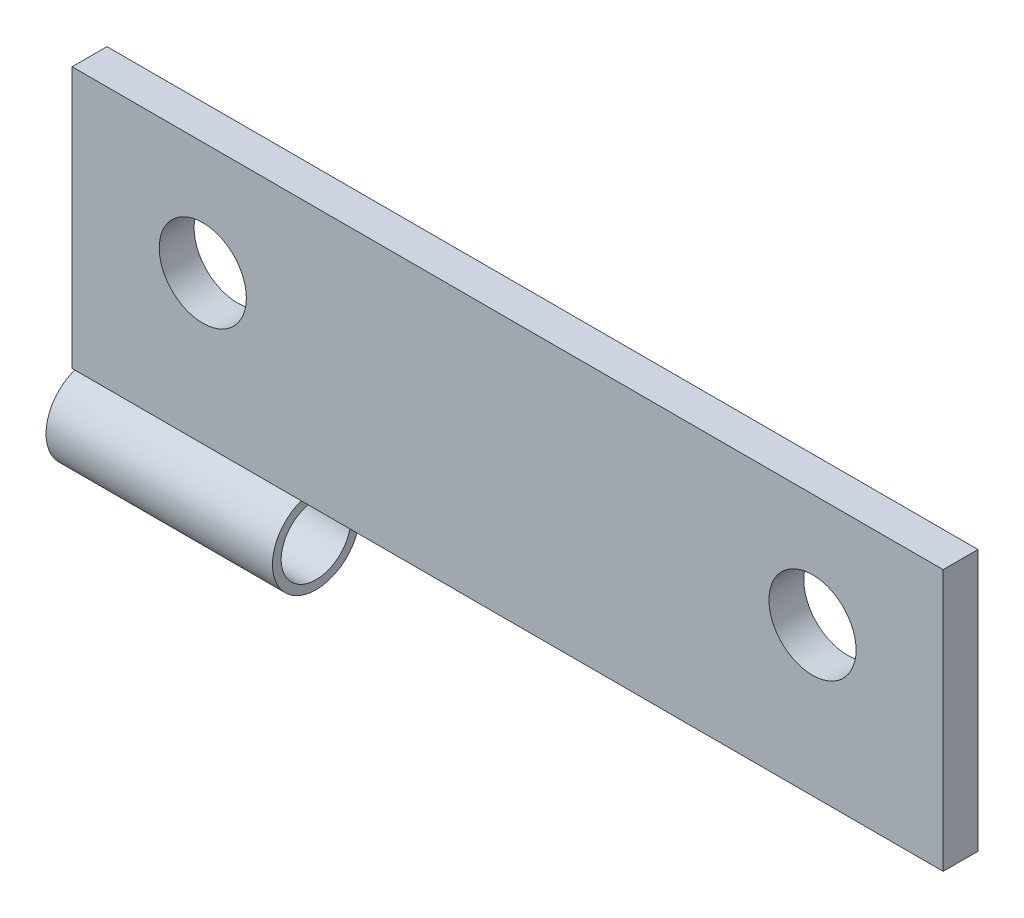
ISO-10303-21;
HEADER;
FILE_DESCRIPTION(('STEP AP214'),'2;1');
FILE_NAME('part.step','',(''),(''),'','','');
FILE_SCHEMA(('AUTOMOTIVE_DESIGN { 1 0 10303 214 1 1 1 1 }'));
ENDSEC;
DATA;
#1=APPLICATION_CONTEXT('core data for automotive mechanical design processes');
#2=APPLICATION_PROTOCOL_DEFINITION('international standard','automotive_design',2000,#1);
#3=PRODUCT_CONTEXT('',#1,'mechanical');
#4=PRODUCT('Part','Part','',(#3));
#5=PRODUCT_RELATED_PRODUCT_CATEGORY('part','',(#4));
#6=PRODUCT_DEFINITION_FORMATION('','',#4);
#7=PRODUCT_DEFINITION_CONTEXT('part definition',#1,'design');
#8=PRODUCT_DEFINITION('design','',#6,#7);
#9=PRODUCT_DEFINITION_SHAPE('','',#8);
#10=(LENGTH_UNIT() NAMED_UNIT(*) SI_UNIT(.MILLI.,.METRE.));
#11=(NAMED_UNIT(*) PLANE_ANGLE_UNIT() SI_UNIT($,.RADIAN.));
#12=(NAMED_UNIT(*) SI_UNIT($,.STERADIAN.) SOLID_ANGLE_UNIT());
#13=UNCERTAINTY_MEASURE_WITH_UNIT(LENGTH_MEASURE(1.E-05),#10,'distance_accuracy_value','');
#14=(GEOMETRIC_REPRESENTATION_CONTEXT(3) GLOBAL_UNCERTAINTY_ASSIGNED_CONTEXT((#13)) GLOBAL_UNIT_ASSIGNED_CONTEXT((#10,
#11,#12)) REPRESENTATION_CONTEXT('',''));
#15=CARTESIAN_POINT('',(0.,0.,0.));
#16=DIRECTION('',(0.,0.,1.));
#17=DIRECTION('',(1.,0.,0.));
#18=AXIS2_PLACEMENT_3D('',#15,#16,#17);
#19=CARTESIAN_POINT('',(6.21190339065838,-14.6397379912664,-1.));
#20=DIRECTION('',(-1.,0.,0.));
#21=DIRECTION('',(0.,0.,1.));
#22=AXIS2_PLACEMENT_3D('',#19,#20,#21);
#23=CYLINDRICAL_SURFACE('',#22,2.5);
#24=CARTESIAN_POINT('',(6.21190339065838,-14.6397379912664,-1.));
#25=DIRECTION('',(-1.,0.,0.));
#26=DIRECTION('',(0.,0.,1.));
#27=AXIS2_PLACEMENT_3D('',#24,#25,#26);
#28=CIRCLE('',#27,2.5);
#29=CARTESIAN_POINT('',(6.21190339065838,-14.6397379912664,1.5));
#30=VERTEX_POINT('',#29);
#31=EDGE_CURVE('E11',#30,#30,#28,.T.);
#32=CARTESIAN_POINT('',(-6.78809660934162,-14.6397379912664,-1.));
#33=DIRECTION('',(-1.,0.,0.));
#34=DIRECTION('',(0.,0.,1.));
#35=AXIS2_PLACEMENT_3D('',#32,#33,#34);
#36=CIRCLE('',#35,2.5);
#37=CARTESIAN_POINT('',(-6.78809660934162,-14.6397379912664,1.5));
#38=VERTEX_POINT('',#37);
#39=EDGE_CURVE('E43',#38,#38,#36,.T.);
#40=CARTESIAN_POINT('',(6.21190339065838,-14.6397379912664,1.5));
#41=CARTESIAN_POINT('',(6.07648672399171,-14.6397379912664,1.5));
#42=CARTESIAN_POINT('',(5.94107005732504,-14.6397379912664,1.5));
#43=CARTESIAN_POINT('',(5.67023672399171,-14.6397379912664,1.5));
#44=CARTESIAN_POINT('',(5.53482005732504,-14.6397379912664,1.5));
#45=CARTESIAN_POINT('',(5.26398672399171,-14.6397379912664,1.5));
#46=CARTESIAN_POINT('',(5.12857005732504,-14.6397379912664,1.5));
#47=CARTESIAN_POINT('',(4.85773672399171,-14.6397379912664,1.5));
#48=CARTESIAN_POINT('',(4.72232005732504,-14.6397379912664,1.5));
#49=CARTESIAN_POINT('',(4.45148672399171,-14.6397379912664,1.5));
#50=CARTESIAN_POINT('',(4.31607005732504,-14.6397379912664,1.5));
#51=CARTESIAN_POINT('',(4.04523672399171,-14.6397379912664,1.5));
#52=CARTESIAN_POINT('',(3.90982005732504,-14.6397379912664,1.5));
#53=CARTESIAN_POINT('',(3.63898672399171,-14.6397379912664,1.5));
#54=CARTESIAN_POINT('',(3.50357005732504,-14.6397379912664,1.5));
#55=CARTESIAN_POINT('',(3.23273672399171,-14.6397379912664,1.5));
#56=CARTESIAN_POINT('',(3.09732005732504,-14.6397379912664,1.5));
#57=CARTESIAN_POINT('',(2.82648672399171,-14.6397379912664,1.5));
#58=CARTESIAN_POINT('',(2.69107005732504,-14.6397379912664,1.5));
#59=CARTESIAN_POINT('',(2.42023672399171,-14.6397379912664,1.5));
#60=CARTESIAN_POINT('',(2.28482005732504,-14.6397379912664,1.5));
#61=CARTESIAN_POINT('',(2.01398672399171,-14.6397379912664,1.5));
#62=CARTESIAN_POINT('',(1.87857005732504,-14.6397379912664,1.5));
#63=CARTESIAN_POINT('',(1.60773672399171,-14.6397379912664,1.5));
#64=CARTESIAN_POINT('',(1.47232005732504,-14.6397379912664,1.5));
#65=CARTESIAN_POINT('',(1.20148672399171,-14.6397379912664,1.5));
#66=CARTESIAN_POINT('',(1.06607005732504,-14.6397379912664,1.5));
#67=CARTESIAN_POINT('',(0.795236723991711,-14.6397379912664,1.5));
#68=CARTESIAN_POINT('',(0.659820057325044,-14.6397379912664,1.5));
#69=CARTESIAN_POINT('',(0.38898672399171,-14.6397379912664,1.5));
#70=CARTESIAN_POINT('',(0.253570057325044,-14.6397379912664,1.5));
#71=CARTESIAN_POINT('',(-0.0172632760082895,-14.6397379912664,1.5));
#72=CARTESIAN_POINT('',(-0.152679942674956,-14.6397379912664,1.5));
#73=CARTESIAN_POINT('',(-0.42351327600829,-14.6397379912664,1.5));
#74=CARTESIAN_POINT('',(-0.558929942674957,-14.6397379912664,1.5));
#75=CARTESIAN_POINT('',(-0.82976327600829,-14.6397379912664,1.5));
#76=CARTESIAN_POINT('',(-0.965179942674956,-14.6397379912664,1.5));
#77=CARTESIAN_POINT('',(-1.23601327600829,-14.6397379912664,1.5));
#78=CARTESIAN_POINT('',(-1.37142994267496,-14.6397379912664,1.5));
#79=CARTESIAN_POINT('',(-1.64226327600829,-14.6397379912664,1.5));
#80=CARTESIAN_POINT('',(-1.77767994267496,-14.6397379912664,1.5));
#81=CARTESIAN_POINT('',(-2.04851327600829,-14.6397379912664,1.5));
#82=CARTESIAN_POINT('',(-2.18392994267496,-14.6397379912664,1.5));
#83=CARTESIAN_POINT('',(-2.45476327600829,-14.6397379912664,1.5));
#84=CARTESIAN_POINT('',(-2.59017994267496,-14.6397379912664,1.5));
#85=CARTESIAN_POINT('',(-2.86101327600829,-14.6397379912664,1.5));
#86=CARTESIAN_POINT('',(-2.99642994267496,-14.6397379912664,1.5));
#87=CARTESIAN_POINT('',(-3.26726327600829,-14.6397379912664,1.5));
#88=CARTESIAN_POINT('',(-3.40267994267496,-14.6397379912664,1.5));
#89=CARTESIAN_POINT('',(-3.67351327600829,-14.6397379912664,1.5));
#90=CARTESIAN_POINT('',(-3.80892994267496,-14.6397379912664,1.5));
#91=CARTESIAN_POINT('',(-4.07976327600829,-14.6397379912664,1.5));
#92=CARTESIAN_POINT('',(-4.21517994267496,-14.6397379912664,1.5));
#93=CARTESIAN_POINT('',(-4.48601327600829,-14.6397379912664,1.5));
#94=CARTESIAN_POINT('',(-4.62142994267496,-14.6397379912664,1.5));
#95=CARTESIAN_POINT('',(-4.89226327600829,-14.6397379912664,1.5));
#96=CARTESIAN_POINT('',(-5.02767994267496,-14.6397379912664,1.5));
#97=CARTESIAN_POINT('',(-5.29851327600829,-14.6397379912664,1.5));
#98=CARTESIAN_POINT('',(-5.43392994267496,-14.6397379912664,1.5));
#99=CARTESIAN_POINT('',(-5.70476327600829,-14.6397379912664,1.5));
#100=CARTESIAN_POINT('',(-5.84017994267496,-14.6397379912664,1.5));
#101=CARTESIAN_POINT('',(-6.11101327600829,-14.6397379912664,1.5));
#102=CARTESIAN_POINT('',(-6.24642994267496,-14.6397379912664,1.5));
#103=CARTESIAN_POINT('',(-6.51726327600829,-14.6397379912664,1.5));
#104=CARTESIAN_POINT('',(-6.65267994267496,-14.6397379912664,1.5));
#105=CARTESIAN_POINT('',(-6.78809660934162,-14.6397379912664,1.5));
#106=B_SPLINE_CURVE_WITH_KNOTS('',3,(#40,#41,#42,#43,#44,#45,#46,#47,#48,#49,#50,#51,#52,#53,
#54,#55,#56,#57,#58,#59,#60,#61,#62,#63,#64,#65,#66,#67,#68,#69,#70,#71,#72,#73,#74,#75,#76,#77,
#78,#79,#80,#81,#82,#83,#84,#85,#86,#87,#88,#89,#90,#91,#92,#93,#94,#95,#96,#97,#98,#99,#100,
#101,#102,#103,#104,#105),.UNSPECIFIED.,.F.,.F.,(4,2,2,2,2,2,2,2,2,2,2,2,2,2,2,2,2,2,2,2,2,2,2,
2,2,2,2,2,2,2,2,2,4),(0.,0.40625,0.812500000000001,1.21875,1.625,2.03125,2.4375,2.84375,3.25,
3.65625,4.0625,4.46875,4.875,5.28125,5.6875,6.09375,6.5,6.90625,7.3125,7.71875,8.125,8.53125,
8.9375,9.34375,9.75,10.15625,10.5625,10.96875,11.375,11.78125,12.1875,12.59375,13.),.UNSPECIFIED.);
#107=EDGE_CURVE('BSEAM40',#30,#38,#106,.T.);
#108=ORIENTED_EDGE('',*,*,#31,.T.);
#109=ORIENTED_EDGE('',*,*,#39,.F.);
#110=ORIENTED_EDGE('',*,*,#107,.T.);
#111=ORIENTED_EDGE('',*,*,#107,.F.);
#112=EDGE_LOOP('',(#108,#110,#109,#111));
#113=FACE_BOUND('',#112,.T.);
#114=ADVANCED_FACE('F40',(#113),#23,.T.);
#115=CARTESIAN_POINT('',(6.21190339065838,-14.6397379912664,-1.));
#116=DIRECTION('',(-1.,0.,0.));
#117=DIRECTION('',(0.,0.,1.));
#118=AXIS2_PLACEMENT_3D('',#115,#116,#117);
#119=PLANE('',#118);
#120=CARTESIAN_POINT('',(6.21190339065838,-14.6397379912664,-1.));
#121=DIRECTION('',(1.,0.,0.));
#122=DIRECTION('',(0.,0.,-1.));
#123=AXIS2_PLACEMENT_3D('',#120,#121,#122);
#124=CIRCLE('',#123,2.);
#125=CARTESIAN_POINT('',(6.21190339065838,-14.6397379912664,-3.));
#126=VERTEX_POINT('',#125);
#127=EDGE_CURVE('E52',#126,#126,#124,.T.);
#128=ORIENTED_EDGE('',*,*,#127,.F.);
#129=EDGE_LOOP('',(#128));
#130=FACE_BOUND('',#129,.T.);
#131=ORIENTED_EDGE('',*,*,#31,.F.);
#132=EDGE_LOOP('',(#131));
#133=FACE_BOUND('',#132,.T.);
#134=ADVANCED_FACE('F67',(#130,#133),#119,.F.);
#135=CARTESIAN_POINT('',(-6.78809660934162,-14.6397379912664,-1.));
#136=DIRECTION('',(-1.,0.,0.));
#137=DIRECTION('',(0.,0.,1.));
#138=AXIS2_PLACEMENT_3D('',#135,#136,#137);
#139=PLANE('',#138);
#140=ORIENTED_EDGE('',*,*,#39,.T.);
#141=EDGE_LOOP('',(#140));
#142=FACE_BOUND('',#141,.T.);
#143=ADVANCED_FACE('F63',(#142),#139,.T.);
#144=CARTESIAN_POINT('',(-2.78809660934162,-14.6397379912664,-1.));
#145=DIRECTION('',(1.,0.,0.));
#146=DIRECTION('',(0.,0.,-1.));
#147=AXIS2_PLACEMENT_3D('',#144,#145,#146);
#148=CYLINDRICAL_SURFACE('',#147,2.);
#149=CARTESIAN_POINT('',(-2.78809660934162,-14.6397379912664,-1.));
#150=DIRECTION('',(1.,0.,0.));
#151=DIRECTION('',(0.,0.,-1.));
#152=AXIS2_PLACEMENT_3D('',#149,#150,#151);
#153=CIRCLE('',#152,2.);
#154=CARTESIAN_POINT('',(-2.78809660934162,-14.6397379912664,-3.));
#155=VERTEX_POINT('',#154);
#156=EDGE_CURVE('E50',#155,#155,#153,.T.);
#157=ORIENTED_EDGE('',*,*,#156,.F.);
#158=EDGE_LOOP('',(#157));
#159=FACE_BOUND('',#158,.T.);
#160=ORIENTED_EDGE('',*,*,#127,.T.);
#161=EDGE_LOOP('',(#160));
#162=FACE_BOUND('',#161,.T.);
#163=ADVANCED_FACE('F60',(#159,#162),#148,.F.);
#164=CARTESIAN_POINT('',(-2.78809660934162,-14.6397379912664,-1.));
#165=DIRECTION('',(1.,0.,0.));
#166=DIRECTION('',(0.,0.,-1.));
#167=AXIS2_PLACEMENT_3D('',#164,#165,#166);
#168=PLANE('',#167);
#169=ORIENTED_EDGE('',*,*,#156,.T.);
#170=EDGE_LOOP('',(#169));
#171=FACE_BOUND('',#170,.T.);
#172=ADVANCED_FACE('F58',(#171),#168,.T.);
#173=CLOSED_SHELL('',(#114,#134,#143,#163,#172));
#174=MANIFOLD_SOLID_BREP('B2',#173);
#175=CARTESIAN_POINT('',(-6.78809660934162,2.86026200873363,-2.));
#176=DIRECTION('',(-1.,0.,0.));
#177=DIRECTION('',(0.,-1.,0.));
#178=AXIS2_PLACEMENT_3D('',#175,#176,#177);
#179=PLANE('',#178);
#180=DIRECTION('',(0.,-1.,0.));
#181=VECTOR('',#180,1.);
#182=CARTESIAN_POINT('',(-6.78809660934162,2.86026200873363,0.));
#183=LINE('',#182,#181);
#184=CARTESIAN_POINT('',(-6.78809660934162,2.86026200873363,0.));
#185=VERTEX_POINT('',#184);
#186=CARTESIAN_POINT('',(-6.78809660934162,-12.1397379912664,0.));
#187=VERTEX_POINT('',#186);
#188=EDGE_CURVE('E177',#185,#187,#183,.T.);
#189=ORIENTED_EDGE('',*,*,#188,.F.);
#190=DIRECTION('',(0.,0.,1.));
#191=VECTOR('',#190,1.);
#192=CARTESIAN_POINT('',(-6.78809660934162,2.86026200873363,-2.));
#193=LINE('',#192,#191);
#194=CARTESIAN_POINT('',(-6.78809660934162,2.86026200873363,-2.));
#195=VERTEX_POINT('',#194);
#196=EDGE_CURVE('E38',#195,#185,#193,.T.);
#197=ORIENTED_EDGE('',*,*,#196,.F.);
#198=DIRECTION('',(0.,-1.,0.));
#199=VECTOR('',#198,1.);
#200=CARTESIAN_POINT('',(-6.78809660934162,2.86026200873363,-2.));
#201=LINE('',#200,#199);
#202=CARTESIAN_POINT('',(-6.78809660934162,-12.1397379912664,-2.));
#203=VERTEX_POINT('',#202);
#204=EDGE_CURVE('E170',#195,#203,#201,.T.);
#205=ORIENTED_EDGE('',*,*,#204,.T.);
#206=DIRECTION('',(0.,0.,1.));
#207=VECTOR('',#206,1.);
#208=CARTESIAN_POINT('',(-6.78809660934162,-12.1397379912664,-2.));
#209=LINE('',#208,#207);
#210=EDGE_CURVE('E153',#203,#187,#209,.T.);
#211=ORIENTED_EDGE('',*,*,#210,.T.);
#212=EDGE_LOOP('',(#189,#197,#205,#211));
#213=FACE_BOUND('',#212,.T.);
#214=ADVANCED_FACE('F110',(#213),#179,.T.);
#215=CARTESIAN_POINT('',(-6.78809660934162,2.86026200873363,-2.));
#216=DIRECTION('',(0.,1.,0.));
#217=DIRECTION('',(0.,0.,1.));
#218=AXIS2_PLACEMENT_3D('',#215,#216,#217);
#219=PLANE('',#218);
#220=DIRECTION('',(-1.,0.,0.));
#221=VECTOR('',#220,1.);
#222=CARTESIAN_POINT('',(-6.78809660934162,2.86026200873363,0.));
#223=LINE('',#222,#221);
#224=CARTESIAN_POINT('',(43.2119033906584,2.86026200873363,0.));
#225=VERTEX_POINT('',#224);
#226=EDGE_CURVE('E172',#225,#185,#223,.T.);
#227=ORIENTED_EDGE('',*,*,#226,.F.);
#228=DIRECTION('',(0.,0.,1.));
#229=VECTOR('',#228,1.);
#230=CARTESIAN_POINT('',(43.2119033906584,2.86026200873363,-2.));
#231=LINE('',#230,#229);
#232=CARTESIAN_POINT('',(43.2119033906584,2.86026200873363,-2.));
#233=VERTEX_POINT('',#232);
#234=EDGE_CURVE('E119',#233,#225,#231,.T.);
#235=ORIENTED_EDGE('',*,*,#234,.F.);
#236=DIRECTION('',(-1.,0.,0.));
#237=VECTOR('',#236,1.);
#238=CARTESIAN_POINT('',(-6.78809660934162,2.86026200873363,-2.));
#239=LINE('',#238,#237);
#240=EDGE_CURVE('E167',#233,#195,#239,.T.);
#241=ORIENTED_EDGE('',*,*,#240,.T.);
#242=ORIENTED_EDGE('',*,*,#196,.T.);
#243=EDGE_LOOP('',(#227,#235,#241,#242));
#244=FACE_BOUND('',#243,.T.);
#245=ADVANCED_FACE('F215',(#244),#219,.T.);
#246=CARTESIAN_POINT('',(43.2119033906584,2.86026200873363,-2.));
#247=DIRECTION('',(1.,0.,0.));
#248=DIRECTION('',(0.,0.,-1.));
#249=AXIS2_PLACEMENT_3D('',#246,#247,#248);
#250=PLANE('',#249);
#251=DIRECTION('',(0.,1.,0.));
#252=VECTOR('',#251,1.);
#253=CARTESIAN_POINT('',(43.2119033906584,2.86026200873363,0.));
#254=LINE('',#253,#252);
#255=CARTESIAN_POINT('',(43.2119033906584,-12.1397379912664,0.));
#256=VERTEX_POINT('',#255);
#257=EDGE_CURVE('E161',#256,#225,#254,.T.);
#258=ORIENTED_EDGE('',*,*,#257,.F.);
#259=DIRECTION('',(0.,0.,1.));
#260=VECTOR('',#259,1.);
#261=CARTESIAN_POINT('',(43.2119033906584,-12.1397379912664,-2.));
#262=LINE('',#261,#260);
#263=CARTESIAN_POINT('',(43.2119033906584,-12.1397379912664,-2.));
#264=VERTEX_POINT('',#263);
#265=EDGE_CURVE('E156',#264,#256,#262,.T.);
#266=ORIENTED_EDGE('',*,*,#265,.F.);
#267=DIRECTION('',(0.,1.,0.));
#268=VECTOR('',#267,1.);
#269=CARTESIAN_POINT('',(43.2119033906584,2.86026200873363,-2.));
#270=LINE('',#269,#268);
#271=EDGE_CURVE('E159',#264,#233,#270,.T.);
#272=ORIENTED_EDGE('',*,*,#271,.T.);
#273=ORIENTED_EDGE('',*,*,#234,.T.);
#274=EDGE_LOOP('',(#258,#266,#272,#273));
#275=FACE_BOUND('',#274,.T.);
#276=ADVANCED_FACE('F158',(#275),#250,.T.);
#277=CARTESIAN_POINT('',(-6.78809660934162,-12.1397379912664,-2.));
#278=DIRECTION('',(0.,-1.,0.));
#279=DIRECTION('',(0.,0.,-1.));
#280=AXIS2_PLACEMENT_3D('',#277,#278,#279);
#281=PLANE('',#280);
#282=DIRECTION('',(1.,0.,0.));
#283=VECTOR('',#282,1.);
#284=CARTESIAN_POINT('',(-6.78809660934162,-12.1397379912664,0.));
#285=LINE('',#284,#283);
#286=EDGE_CURVE('E180',#187,#256,#285,.T.);
#287=ORIENTED_EDGE('',*,*,#286,.F.);
#288=ORIENTED_EDGE('',*,*,#210,.F.);
#289=DIRECTION('',(1.,0.,0.));
#290=VECTOR('',#289,1.);
#291=CARTESIAN_POINT('',(-6.78809660934162,-12.1397379912664,-2.));
#292=LINE('',#291,#290);
#293=EDGE_CURVE('E166',#203,#264,#292,.T.);
#294=ORIENTED_EDGE('',*,*,#293,.T.);
#295=ORIENTED_EDGE('',*,*,#265,.T.);
#296=EDGE_LOOP('',(#287,#288,#294,#295));
#297=FACE_BOUND('',#296,.T.);
#298=ADVANCED_FACE('F169',(#297),#281,.T.);
#299=CARTESIAN_POINT('',(0.,0.,-2.));
#300=DIRECTION('',(0.,0.,1.));
#301=DIRECTION('',(1.,0.,0.));
#302=AXIS2_PLACEMENT_3D('',#299,#300,#301);
#303=PLANE('',#302);
#304=CARTESIAN_POINT('',(0.711903390658374,-3.63973799126637,-2.));
#305=DIRECTION('',(0.,0.,-1.));
#306=DIRECTION('',(-1.,0.,0.));
#307=AXIS2_PLACEMENT_3D('',#304,#305,#306);
#308=CIRCLE('',#307,2.5);
#309=CARTESIAN_POINT('',(-1.78809660934163,-3.63973799126637,-2.));
#310=VERTEX_POINT('',#309);
#311=EDGE_CURVE('E195',#310,#310,#308,.T.);
#312=ORIENTED_EDGE('',*,*,#311,.F.);
#313=EDGE_LOOP('',(#312));
#314=FACE_BOUND('',#313,.T.);
#315=CARTESIAN_POINT('',(35.7119033906584,-3.63973799126637,-2.));
#316=DIRECTION('',(0.,0.,-1.));
#317=DIRECTION('',(-1.,0.,0.));
#318=AXIS2_PLACEMENT_3D('',#315,#316,#317);
#319=CIRCLE('',#318,2.49999999999999);
#320=CARTESIAN_POINT('',(33.2119033906584,-3.63973799126637,-2.));
#321=VERTEX_POINT('',#320);
#322=EDGE_CURVE('E188',#321,#321,#319,.T.);
#323=ORIENTED_EDGE('',*,*,#322,.F.);
#324=EDGE_LOOP('',(#323));
#325=FACE_BOUND('',#324,.T.);
#326=ORIENTED_EDGE('',*,*,#204,.F.);
#327=ORIENTED_EDGE('',*,*,#240,.F.);
#328=ORIENTED_EDGE('',*,*,#271,.F.);
#329=ORIENTED_EDGE('',*,*,#293,.F.);
#330=EDGE_LOOP('',(#326,#327,#328,#329));
#331=FACE_BOUND('',#330,.T.);
#332=ADVANCED_FACE('F165',(#314,#325,#331),#303,.F.);
#333=CARTESIAN_POINT('',(0.,0.,0.));
#334=DIRECTION('',(0.,0.,1.));
#335=DIRECTION('',(1.,0.,0.));
#336=AXIS2_PLACEMENT_3D('',#333,#334,#335);
#337=PLANE('',#336);
#338=CARTESIAN_POINT('',(0.711903390658374,-3.63973799126637,0.));
#339=DIRECTION('',(0.,0.,1.));
#340=DIRECTION('',(1.,0.,0.));
#341=AXIS2_PLACEMENT_3D('',#338,#339,#340);
#342=CIRCLE('',#341,2.5);
#343=CARTESIAN_POINT('',(3.21190339065837,-3.63973799126637,0.));
#344=VERTEX_POINT('',#343);
#345=EDGE_CURVE('E113',#344,#344,#342,.T.);
#346=ORIENTED_EDGE('',*,*,#345,.F.);
#347=EDGE_LOOP('',(#346));
#348=FACE_BOUND('',#347,.T.);
#349=CARTESIAN_POINT('',(35.7119033906584,-3.63973799126637,0.));
#350=DIRECTION('',(0.,0.,1.));
#351=DIRECTION('',(1.,0.,0.));
#352=AXIS2_PLACEMENT_3D('',#349,#350,#351);
#353=CIRCLE('',#352,2.49999999999999);
#354=CARTESIAN_POINT('',(38.2119033906584,-3.63973799126637,0.));
#355=VERTEX_POINT('',#354);
#356=EDGE_CURVE('E181',#355,#355,#353,.T.);
#357=ORIENTED_EDGE('',*,*,#356,.F.);
#358=EDGE_LOOP('',(#357));
#359=FACE_BOUND('',#358,.T.);
#360=ORIENTED_EDGE('',*,*,#188,.T.);
#361=ORIENTED_EDGE('',*,*,#286,.T.);
#362=ORIENTED_EDGE('',*,*,#257,.T.);
#363=ORIENTED_EDGE('',*,*,#226,.T.);
#364=EDGE_LOOP('',(#360,#361,#362,#363));
#365=FACE_BOUND('',#364,.T.);
#366=ADVANCED_FACE('F204',(#348,#359,#365),#337,.T.);
#367=CARTESIAN_POINT('',(35.7119033906584,-3.63973799126637,1.5));
#368=DIRECTION('',(0.,0.,-1.));
#369=DIRECTION('',(-1.,0.,0.));
#370=AXIS2_PLACEMENT_3D('',#367,#368,#369);
#371=CYLINDRICAL_SURFACE('',#370,2.49999999999999);
#372=ORIENTED_EDGE('',*,*,#356,.T.);
#373=EDGE_LOOP('',(#372));
#374=FACE_BOUND('',#373,.T.);
#375=ORIENTED_EDGE('',*,*,#322,.T.);
#376=EDGE_LOOP('',(#375));
#377=FACE_BOUND('',#376,.T.);
#378=ADVANCED_FACE('F210',(#374,#377),#371,.F.);
#379=CARTESIAN_POINT('',(0.711903390658374,-3.63973799126637,1.5));
#380=DIRECTION('',(0.,0.,-1.));
#381=DIRECTION('',(-1.,0.,0.));
#382=AXIS2_PLACEMENT_3D('',#379,#380,#381);
#383=CYLINDRICAL_SURFACE('',#382,2.5);
#384=ORIENTED_EDGE('',*,*,#345,.T.);
#385=EDGE_LOOP('',(#384));
#386=FACE_BOUND('',#385,.T.);
#387=ORIENTED_EDGE('',*,*,#311,.T.);
#388=EDGE_LOOP('',(#387));
#389=FACE_BOUND('',#388,.T.);
#390=ADVANCED_FACE('F200',(#386,#389),#383,.F.);
#391=CLOSED_SHELL('',(#214,#245,#276,#298,#332,#366,#378,#390));
#392=MANIFOLD_SOLID_BREP('B6',#391);
#393=ADVANCED_BREP_SHAPE_REPRESENTATION('',(#18,#174,#392),#14);
#394=SHAPE_DEFINITION_REPRESENTATION(#9,#393);
ENDSEC;
END-ISO-10303-21;
